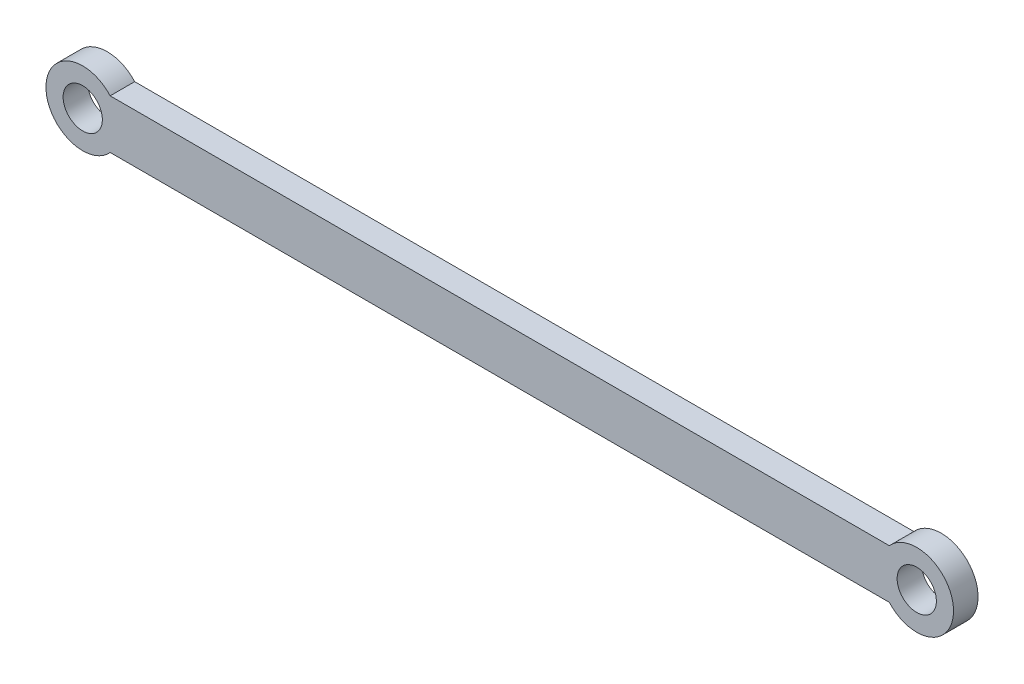
ISO-10303-21;
HEADER;
FILE_DESCRIPTION(('STEP AP214'),'2;1');
FILE_NAME('part.step','',(''),(''),'','','');
FILE_SCHEMA(('AUTOMOTIVE_DESIGN { 1 0 10303 214 1 1 1 1 }'));
ENDSEC;
DATA;
#1=APPLICATION_CONTEXT('core data for automotive mechanical design processes');
#2=APPLICATION_PROTOCOL_DEFINITION('international standard','automotive_design',2000,#1);
#3=PRODUCT_CONTEXT('',#1,'mechanical');
#4=PRODUCT('Part','Part','',(#3));
#5=PRODUCT_RELATED_PRODUCT_CATEGORY('part','',(#4));
#6=PRODUCT_DEFINITION_FORMATION('','',#4);
#7=PRODUCT_DEFINITION_CONTEXT('part definition',#1,'design');
#8=PRODUCT_DEFINITION('design','',#6,#7);
#9=PRODUCT_DEFINITION_SHAPE('','',#8);
#10=(LENGTH_UNIT() NAMED_UNIT(*) SI_UNIT(.MILLI.,.METRE.));
#11=(NAMED_UNIT(*) PLANE_ANGLE_UNIT() SI_UNIT($,.RADIAN.));
#12=(NAMED_UNIT(*) SI_UNIT($,.STERADIAN.) SOLID_ANGLE_UNIT());
#13=UNCERTAINTY_MEASURE_WITH_UNIT(LENGTH_MEASURE(1.E-05),#10,'distance_accuracy_value','');
#14=(GEOMETRIC_REPRESENTATION_CONTEXT(3) GLOBAL_UNCERTAINTY_ASSIGNED_CONTEXT((#13)) GLOBAL_UNIT_ASSIGNED_CONTEXT((#10,
#11,#12)) REPRESENTATION_CONTEXT('',''));
#15=CARTESIAN_POINT('',(0.,0.,0.));
#16=DIRECTION('',(0.,0.,1.));
#17=DIRECTION('',(1.,0.,0.));
#18=AXIS2_PLACEMENT_3D('',#15,#16,#17);
#19=CARTESIAN_POINT('',(0.,0.,5.));
#20=DIRECTION('',(0.,0.,1.));
#21=DIRECTION('',(1.,0.,0.));
#22=AXIS2_PLACEMENT_3D('',#19,#20,#21);
#23=PLANE('',#22);
#24=CARTESIAN_POINT('',(0.,0.,5.));
#25=DIRECTION('',(0.,0.,1.));
#26=DIRECTION('',(1.,0.,0.));
#27=AXIS2_PLACEMENT_3D('',#24,#25,#26);
#28=CIRCLE('',#27,4.);
#29=CARTESIAN_POINT('',(4.,0.,5.));
#30=VERTEX_POINT('',#29);
#31=EDGE_CURVE('E99',#30,#30,#28,.T.);
#32=ORIENTED_EDGE('',*,*,#31,.F.);
#33=EDGE_LOOP('',(#32));
#34=FACE_BOUND('',#33,.T.);
#35=CARTESIAN_POINT('',(0.,0.,5.));
#36=DIRECTION('',(0.,0.,1.));
#37=DIRECTION('',(1.,0.,0.));
#38=AXIS2_PLACEMENT_3D('',#35,#36,#37);
#39=CIRCLE('',#38,7.5);
#40=CARTESIAN_POINT('',(5.59016994374947,5.,5.));
#41=VERTEX_POINT('',#40);
#42=CARTESIAN_POINT('',(5.59016994374947,-5.,5.));
#43=VERTEX_POINT('',#42);
#44=EDGE_CURVE('E84',#41,#43,#39,.T.);
#45=ORIENTED_EDGE('',*,*,#44,.T.);
#46=DIRECTION('',(1.,0.,0.));
#47=VECTOR('',#46,1.);
#48=CARTESIAN_POINT('',(5.59016994374947,-5.,5.));
#49=LINE('',#48,#47);
#50=CARTESIAN_POINT('',(164.409830056251,-5.,5.));
#51=VERTEX_POINT('',#50);
#52=EDGE_CURVE('E79',#43,#51,#49,.T.);
#53=ORIENTED_EDGE('',*,*,#52,.T.);
#54=CARTESIAN_POINT('',(170.,0.,5.));
#55=DIRECTION('',(0.,0.,1.));
#56=DIRECTION('',(1.,0.,0.));
#57=AXIS2_PLACEMENT_3D('',#54,#55,#56);
#58=CIRCLE('',#57,7.5);
#59=CARTESIAN_POINT('',(164.409830056251,5.,5.));
#60=VERTEX_POINT('',#59);
#61=EDGE_CURVE('E82',#51,#60,#58,.T.);
#62=ORIENTED_EDGE('',*,*,#61,.T.);
#63=DIRECTION('',(-1.,0.,0.));
#64=VECTOR('',#63,1.);
#65=CARTESIAN_POINT('',(5.59016994374947,5.,5.));
#66=LINE('',#65,#64);
#67=EDGE_CURVE('E49',#60,#41,#66,.T.);
#68=ORIENTED_EDGE('',*,*,#67,.T.);
#69=EDGE_LOOP('',(#45,#53,#62,#68));
#70=FACE_BOUND('',#69,.T.);
#71=CARTESIAN_POINT('',(170.,0.,5.));
#72=DIRECTION('',(0.,0.,1.));
#73=DIRECTION('',(1.,0.,0.));
#74=AXIS2_PLACEMENT_3D('',#71,#72,#73);
#75=CIRCLE('',#74,3.99999999999999);
#76=CARTESIAN_POINT('',(174.,0.,5.));
#77=VERTEX_POINT('',#76);
#78=EDGE_CURVE('E114',#77,#77,#75,.T.);
#79=ORIENTED_EDGE('',*,*,#78,.F.);
#80=EDGE_LOOP('',(#79));
#81=FACE_BOUND('',#80,.T.);
#82=ADVANCED_FACE('F32',(#34,#70,#81),#23,.T.);
#83=CARTESIAN_POINT('',(0.,0.,0.));
#84=DIRECTION('',(0.,0.,1.));
#85=DIRECTION('',(1.,0.,0.));
#86=AXIS2_PLACEMENT_3D('',#83,#84,#85);
#87=PLANE('',#86);
#88=CARTESIAN_POINT('',(0.,0.,0.));
#89=DIRECTION('',(0.,0.,1.));
#90=DIRECTION('',(1.,0.,0.));
#91=AXIS2_PLACEMENT_3D('',#88,#89,#90);
#92=CIRCLE('',#91,4.);
#93=CARTESIAN_POINT('',(4.,0.,0.));
#94=VERTEX_POINT('',#93);
#95=EDGE_CURVE('E111',#94,#94,#92,.T.);
#96=ORIENTED_EDGE('',*,*,#95,.T.);
#97=EDGE_LOOP('',(#96));
#98=FACE_BOUND('',#97,.T.);
#99=CARTESIAN_POINT('',(0.,0.,0.));
#100=DIRECTION('',(0.,0.,1.));
#101=DIRECTION('',(1.,0.,0.));
#102=AXIS2_PLACEMENT_3D('',#99,#100,#101);
#103=CIRCLE('',#102,7.5);
#104=CARTESIAN_POINT('',(5.59016994374947,5.,0.));
#105=VERTEX_POINT('',#104);
#106=CARTESIAN_POINT('',(5.59016994374947,-5.,0.));
#107=VERTEX_POINT('',#106);
#108=EDGE_CURVE('E96',#105,#107,#103,.T.);
#109=ORIENTED_EDGE('',*,*,#108,.F.);
#110=DIRECTION('',(-1.,0.,0.));
#111=VECTOR('',#110,1.);
#112=CARTESIAN_POINT('',(5.59016994374947,5.,0.));
#113=LINE('',#112,#111);
#114=CARTESIAN_POINT('',(164.409830056251,5.,0.));
#115=VERTEX_POINT('',#114);
#116=EDGE_CURVE('E72',#115,#105,#113,.T.);
#117=ORIENTED_EDGE('',*,*,#116,.F.);
#118=CARTESIAN_POINT('',(170.,0.,0.));
#119=DIRECTION('',(0.,0.,1.));
#120=DIRECTION('',(1.,0.,0.));
#121=AXIS2_PLACEMENT_3D('',#118,#119,#120);
#122=CIRCLE('',#121,7.5);
#123=CARTESIAN_POINT('',(164.409830056251,-5.,0.));
#124=VERTEX_POINT('',#123);
#125=EDGE_CURVE('E66',#124,#115,#122,.T.);
#126=ORIENTED_EDGE('',*,*,#125,.F.);
#127=DIRECTION('',(1.,0.,0.));
#128=VECTOR('',#127,1.);
#129=CARTESIAN_POINT('',(5.59016994374947,-5.,0.));
#130=LINE('',#129,#128);
#131=EDGE_CURVE('E88',#107,#124,#130,.T.);
#132=ORIENTED_EDGE('',*,*,#131,.F.);
#133=EDGE_LOOP('',(#109,#117,#126,#132));
#134=FACE_BOUND('',#133,.T.);
#135=CARTESIAN_POINT('',(170.,0.,0.));
#136=DIRECTION('',(0.,0.,1.));
#137=DIRECTION('',(1.,0.,0.));
#138=AXIS2_PLACEMENT_3D('',#135,#136,#137);
#139=CIRCLE('',#138,3.99999999999999);
#140=CARTESIAN_POINT('',(174.,0.,0.));
#141=VERTEX_POINT('',#140);
#142=EDGE_CURVE('E117',#141,#141,#139,.T.);
#143=ORIENTED_EDGE('',*,*,#142,.T.);
#144=EDGE_LOOP('',(#143));
#145=FACE_BOUND('',#144,.T.);
#146=ADVANCED_FACE('F107',(#98,#134,#145),#87,.F.);
#147=CARTESIAN_POINT('',(0.,0.,5.));
#148=DIRECTION('',(0.,0.,-1.));
#149=DIRECTION('',(-1.,0.,0.));
#150=AXIS2_PLACEMENT_3D('',#147,#148,#149);
#151=CYLINDRICAL_SURFACE('',#150,7.5);
#152=ORIENTED_EDGE('',*,*,#108,.T.);
#153=DIRECTION('',(0.,0.,-1.));
#154=VECTOR('',#153,1.);
#155=CARTESIAN_POINT('',(5.59016994374947,-5.,5.));
#156=LINE('',#155,#154);
#157=EDGE_CURVE('E11',#43,#107,#156,.T.);
#158=ORIENTED_EDGE('',*,*,#157,.F.);
#159=ORIENTED_EDGE('',*,*,#44,.F.);
#160=DIRECTION('',(0.,0.,-1.));
#161=VECTOR('',#160,1.);
#162=CARTESIAN_POINT('',(5.59016994374947,5.,5.));
#163=LINE('',#162,#161);
#164=EDGE_CURVE('E92',#41,#105,#163,.T.);
#165=ORIENTED_EDGE('',*,*,#164,.T.);
#166=EDGE_LOOP('',(#152,#158,#159,#165));
#167=FACE_BOUND('',#166,.T.);
#168=ADVANCED_FACE('F34',(#167),#151,.T.);
#169=CARTESIAN_POINT('',(5.59016994374947,-5.,5.));
#170=DIRECTION('',(0.,1.,0.));
#171=DIRECTION('',(0.,0.,1.));
#172=AXIS2_PLACEMENT_3D('',#169,#170,#171);
#173=PLANE('',#172);
#174=ORIENTED_EDGE('',*,*,#131,.T.);
#175=DIRECTION('',(0.,0.,-1.));
#176=VECTOR('',#175,1.);
#177=CARTESIAN_POINT('',(164.409830056251,-5.,5.));
#178=LINE('',#177,#176);
#179=EDGE_CURVE('E41',#51,#124,#178,.T.);
#180=ORIENTED_EDGE('',*,*,#179,.F.);
#181=ORIENTED_EDGE('',*,*,#52,.F.);
#182=ORIENTED_EDGE('',*,*,#157,.T.);
#183=EDGE_LOOP('',(#174,#180,#181,#182));
#184=FACE_BOUND('',#183,.T.);
#185=ADVANCED_FACE('F87',(#184),#173,.F.);
#186=CARTESIAN_POINT('',(170.,0.,5.));
#187=DIRECTION('',(0.,0.,-1.));
#188=DIRECTION('',(-1.,0.,0.));
#189=AXIS2_PLACEMENT_3D('',#186,#187,#188);
#190=CYLINDRICAL_SURFACE('',#189,7.5);
#191=ORIENTED_EDGE('',*,*,#125,.T.);
#192=DIRECTION('',(0.,0.,-1.));
#193=VECTOR('',#192,1.);
#194=CARTESIAN_POINT('',(164.409830056251,5.,5.));
#195=LINE('',#194,#193);
#196=EDGE_CURVE('E89',#60,#115,#195,.T.);
#197=ORIENTED_EDGE('',*,*,#196,.F.);
#198=ORIENTED_EDGE('',*,*,#61,.F.);
#199=ORIENTED_EDGE('',*,*,#179,.T.);
#200=EDGE_LOOP('',(#191,#197,#198,#199));
#201=FACE_BOUND('',#200,.T.);
#202=ADVANCED_FACE('F90',(#201),#190,.T.);
#203=CARTESIAN_POINT('',(5.59016994374947,5.,5.));
#204=DIRECTION('',(0.,-1.,0.));
#205=DIRECTION('',(0.,0.,-1.));
#206=AXIS2_PLACEMENT_3D('',#203,#204,#205);
#207=PLANE('',#206);
#208=ORIENTED_EDGE('',*,*,#116,.T.);
#209=ORIENTED_EDGE('',*,*,#164,.F.);
#210=ORIENTED_EDGE('',*,*,#67,.F.);
#211=ORIENTED_EDGE('',*,*,#196,.T.);
#212=EDGE_LOOP('',(#208,#209,#210,#211));
#213=FACE_BOUND('',#212,.T.);
#214=ADVANCED_FACE('F104',(#213),#207,.F.);
#215=CARTESIAN_POINT('',(0.,0.,5.));
#216=DIRECTION('',(0.,0.,-1.));
#217=DIRECTION('',(-1.,0.,0.));
#218=AXIS2_PLACEMENT_3D('',#215,#216,#217);
#219=CYLINDRICAL_SURFACE('',#218,4.);
#220=ORIENTED_EDGE('',*,*,#31,.T.);
#221=EDGE_LOOP('',(#220));
#222=FACE_BOUND('',#221,.T.);
#223=ORIENTED_EDGE('',*,*,#95,.F.);
#224=EDGE_LOOP('',(#223));
#225=FACE_BOUND('',#224,.T.);
#226=ADVANCED_FACE('F135',(#222,#225),#219,.F.);
#227=CARTESIAN_POINT('',(170.,0.,5.));
#228=DIRECTION('',(0.,0.,-1.));
#229=DIRECTION('',(-1.,0.,0.));
#230=AXIS2_PLACEMENT_3D('',#227,#228,#229);
#231=CYLINDRICAL_SURFACE('',#230,3.99999999999999);
#232=ORIENTED_EDGE('',*,*,#78,.T.);
#233=EDGE_LOOP('',(#232));
#234=FACE_BOUND('',#233,.T.);
#235=ORIENTED_EDGE('',*,*,#142,.F.);
#236=EDGE_LOOP('',(#235));
#237=FACE_BOUND('',#236,.T.);
#238=ADVANCED_FACE('F123',(#234,#237),#231,.F.);
#239=CLOSED_SHELL('',(#82,#146,#168,#185,#202,#214,#226,#238));
#240=MANIFOLD_SOLID_BREP('B2',#239);
#241=ADVANCED_BREP_SHAPE_REPRESENTATION('',(#18,#240),#14);
#242=SHAPE_DEFINITION_REPRESENTATION(#9,#241);
ENDSEC;
END-ISO-10303-21;
